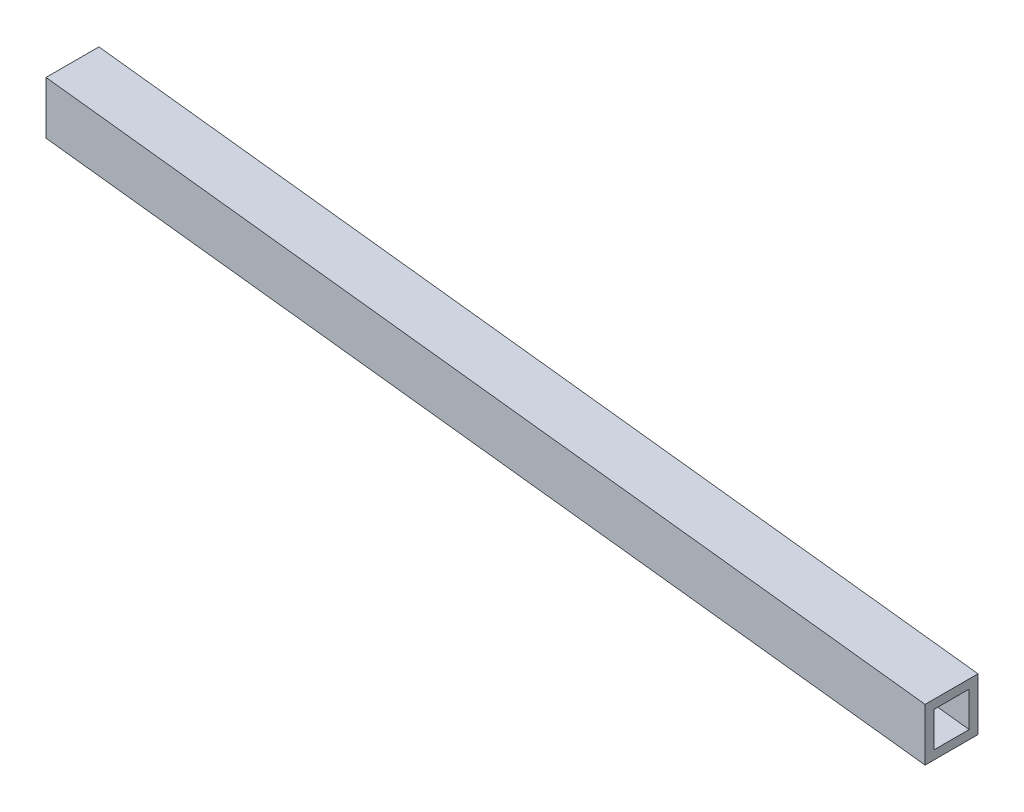
ISO-10303-21;
HEADER;
FILE_DESCRIPTION(('STEP AP214'),'2;1');
FILE_NAME('part.step','',(''),(''),'','','');
FILE_SCHEMA(('AUTOMOTIVE_DESIGN { 1 0 10303 214 1 1 1 1 }'));
ENDSEC;
DATA;
#1=APPLICATION_CONTEXT('core data for automotive mechanical design processes');
#2=APPLICATION_PROTOCOL_DEFINITION('international standard','automotive_design',2000,#1);
#3=PRODUCT_CONTEXT('',#1,'mechanical');
#4=PRODUCT('Part','Part','',(#3));
#5=PRODUCT_RELATED_PRODUCT_CATEGORY('part','',(#4));
#6=PRODUCT_DEFINITION_FORMATION('','',#4);
#7=PRODUCT_DEFINITION_CONTEXT('part definition',#1,'design');
#8=PRODUCT_DEFINITION('design','',#6,#7);
#9=PRODUCT_DEFINITION_SHAPE('','',#8);
#10=(LENGTH_UNIT() NAMED_UNIT(*) SI_UNIT(.MILLI.,.METRE.));
#11=(NAMED_UNIT(*) PLANE_ANGLE_UNIT() SI_UNIT($,.RADIAN.));
#12=(NAMED_UNIT(*) SI_UNIT($,.STERADIAN.) SOLID_ANGLE_UNIT());
#13=UNCERTAINTY_MEASURE_WITH_UNIT(LENGTH_MEASURE(1.E-05),#10,'distance_accuracy_value','');
#14=(GEOMETRIC_REPRESENTATION_CONTEXT(3) GLOBAL_UNCERTAINTY_ASSIGNED_CONTEXT((#13)) GLOBAL_UNIT_ASSIGNED_CONTEXT((#10,
#11,#12)) REPRESENTATION_CONTEXT('',''));
#15=CARTESIAN_POINT('',(0.,0.,0.));
#16=DIRECTION('',(0.,0.,1.));
#17=DIRECTION('',(1.,0.,0.));
#18=AXIS2_PLACEMENT_3D('',#15,#16,#17);
#19=CARTESIAN_POINT('',(711.2,3.175,0.));
#20=DIRECTION('',(0.,1.,0.));
#21=DIRECTION('',(0.,0.,1.));
#22=AXIS2_PLACEMENT_3D('',#19,#20,#21);
#23=PLANE('',#22);
#24=DIRECTION('',(-0.994505452921406,0.,-0.104684784518043));
#25=VECTOR('',#24,1.);
#26=CARTESIAN_POINT('',(711.532374190845,3.175,-3.15755481302547));
#27=LINE('',#26,#25);
#28=CARTESIAN_POINT('',(711.2,3.175,-3.1925415699565));
#29=VERTEX_POINT('',#28);
#30=CARTESIAN_POINT('',(355.6,3.175,-40.624120517325));
#31=VERTEX_POINT('',#30);
#32=EDGE_CURVE('E141',#29,#31,#27,.T.);
#33=ORIENTED_EDGE('',*,*,#32,.F.);
#34=DIRECTION('',(0.,0.,-1.));
#35=VECTOR('',#34,1.);
#36=CARTESIAN_POINT('',(711.2,3.175,0.));
#37=LINE('',#36,#35);
#38=CARTESIAN_POINT('',(711.2,3.175,-15.9627078497824));
#39=VERTEX_POINT('',#38);
#40=EDGE_CURVE('E45',#29,#39,#37,.T.);
#41=ORIENTED_EDGE('',*,*,#40,.T.);
#42=DIRECTION('',(0.994505452921406,0.,0.104684784518043));
#43=VECTOR('',#42,1.);
#44=CARTESIAN_POINT('',(712.861870954224,3.175,-15.7877740651273));
#45=LINE('',#44,#43);
#46=CARTESIAN_POINT('',(355.6,3.175,-53.394286797151));
#47=VERTEX_POINT('',#46);
#48=EDGE_CURVE('E150',#47,#39,#45,.T.);
#49=ORIENTED_EDGE('',*,*,#48,.F.);
#50=DIRECTION('',(0.,0.,1.));
#51=VECTOR('',#50,1.);
#52=CARTESIAN_POINT('',(355.6,3.175,0.));
#53=LINE('',#52,#51);
#54=EDGE_CURVE('E159',#47,#31,#53,.T.);
#55=ORIENTED_EDGE('',*,*,#54,.T.);
#56=EDGE_LOOP('',(#33,#41,#49,#55));
#57=FACE_BOUND('',#56,.T.);
#58=ADVANCED_FACE('F41',(#57),#23,.T.);
#59=CARTESIAN_POINT('',(711.2,3.175,0.));
#60=DIRECTION('',(-0.104684784518043,0.,0.994505452921406));
#61=DIRECTION('',(-0.994505452921406,0.,-0.104684784518043));
#62=AXIS2_PLACEMENT_3D('',#59,#60,#61);
#63=PLANE('',#62);
#64=DIRECTION('',(0.994505452921406,0.,0.104684784518043));
#65=VECTOR('',#64,1.);
#66=CARTESIAN_POINT('',(711.2,0.,0.));
#67=LINE('',#66,#65);
#68=CARTESIAN_POINT('',(355.6,0.,-37.4315789473684));
#69=VERTEX_POINT('',#68);
#70=CARTESIAN_POINT('',(711.2,0.,0.));
#71=VERTEX_POINT('',#70);
#72=EDGE_CURVE('E164',#69,#71,#67,.T.);
#73=ORIENTED_EDGE('',*,*,#72,.T.);
#74=DIRECTION('',(0.,-1.,0.));
#75=VECTOR('',#74,1.);
#76=CARTESIAN_POINT('',(711.2,3.175,0.));
#77=LINE('',#76,#75);
#78=CARTESIAN_POINT('',(711.2,19.05,0.));
#79=VERTEX_POINT('',#78);
#80=EDGE_CURVE('E131',#79,#71,#77,.T.);
#81=ORIENTED_EDGE('',*,*,#80,.F.);
#82=DIRECTION('',(-0.994505452921406,0.,-0.104684784518043));
#83=VECTOR('',#82,1.);
#84=CARTESIAN_POINT('',(711.2,19.05,0.));
#85=LINE('',#84,#83);
#86=CARTESIAN_POINT('',(355.6,19.05,-37.4315789473684));
#87=VERTEX_POINT('',#86);
#88=EDGE_CURVE('E115',#79,#87,#85,.T.);
#89=ORIENTED_EDGE('',*,*,#88,.T.);
#90=DIRECTION('',(0.,-1.,0.));
#91=VECTOR('',#90,1.);
#92=CARTESIAN_POINT('',(355.6,3.175,-37.4315789473684));
#93=LINE('',#92,#91);
#94=EDGE_CURVE('E11',#87,#69,#93,.T.);
#95=ORIENTED_EDGE('',*,*,#94,.T.);
#96=EDGE_LOOP('',(#73,#81,#89,#95));
#97=FACE_BOUND('',#96,.T.);
#98=ADVANCED_FACE('F43',(#97),#63,.T.);
#99=CARTESIAN_POINT('',(355.6,3.175,0.));
#100=DIRECTION('',(-1.,0.,0.));
#101=DIRECTION('',(0.,0.,-1.));
#102=AXIS2_PLACEMENT_3D('',#99,#100,#101);
#103=PLANE('',#102);
#104=DIRECTION('',(0.,-1.,0.));
#105=VECTOR('',#104,1.);
#106=CARTESIAN_POINT('',(355.6,3.175,-56.5868283671075));
#107=LINE('',#106,#105);
#108=CARTESIAN_POINT('',(355.6,19.05,-56.5868283671075));
#109=VERTEX_POINT('',#108);
#110=CARTESIAN_POINT('',(355.6,0.,-56.5868283671075));
#111=VERTEX_POINT('',#110);
#112=EDGE_CURVE('E51',#109,#111,#107,.T.);
#113=ORIENTED_EDGE('',*,*,#112,.T.);
#114=DIRECTION('',(0.,0.,1.));
#115=VECTOR('',#114,1.);
#116=CARTESIAN_POINT('',(355.6,0.,0.));
#117=LINE('',#116,#115);
#118=EDGE_CURVE('E126',#111,#69,#117,.T.);
#119=ORIENTED_EDGE('',*,*,#118,.T.);
#120=ORIENTED_EDGE('',*,*,#94,.F.);
#121=DIRECTION('',(0.,0.,-1.));
#122=VECTOR('',#121,1.);
#123=CARTESIAN_POINT('',(355.6,19.05,-56.5868283671075));
#124=LINE('',#123,#122);
#125=EDGE_CURVE('E111',#87,#109,#124,.T.);
#126=ORIENTED_EDGE('',*,*,#125,.T.);
#127=EDGE_LOOP('',(#113,#119,#120,#126));
#128=FACE_BOUND('',#127,.T.);
#129=DIRECTION('',(0.,0.,-1.));
#130=VECTOR('',#129,1.);
#131=CARTESIAN_POINT('',(355.6,15.875,-56.5868283671075));
#132=LINE('',#131,#130);
#133=CARTESIAN_POINT('',(355.6,15.875,-40.624120517325));
#134=VERTEX_POINT('',#133);
#135=CARTESIAN_POINT('',(355.6,15.875,-53.394286797151));
#136=VERTEX_POINT('',#135);
#137=EDGE_CURVE('E135',#134,#136,#132,.T.);
#138=ORIENTED_EDGE('',*,*,#137,.F.);
#139=DIRECTION('',(0.,-1.,0.));
#140=VECTOR('',#139,1.);
#141=CARTESIAN_POINT('',(355.6,15.875,-40.624120517325));
#142=LINE('',#141,#140);
#143=EDGE_CURVE('E146',#134,#31,#142,.T.);
#144=ORIENTED_EDGE('',*,*,#143,.T.);
#145=ORIENTED_EDGE('',*,*,#54,.F.);
#146=DIRECTION('',(0.,-1.,0.));
#147=VECTOR('',#146,1.);
#148=CARTESIAN_POINT('',(355.6,15.875,-53.394286797151));
#149=LINE('',#148,#147);
#150=EDGE_CURVE('E161',#136,#47,#149,.T.);
#151=ORIENTED_EDGE('',*,*,#150,.F.);
#152=EDGE_LOOP('',(#138,#144,#145,#151));
#153=FACE_BOUND('',#152,.T.);
#154=ADVANCED_FACE('F123',(#128,#153),#103,.T.);
#155=CARTESIAN_POINT('',(713.194245145069,3.175,-18.9453288781528));
#156=DIRECTION('',(0.104684784518043,0.,-0.994505452921406));
#157=DIRECTION('',(0.994505452921406,0.,0.104684784518043));
#158=AXIS2_PLACEMENT_3D('',#155,#156,#157);
#159=PLANE('',#158);
#160=DIRECTION('',(-0.994505452921406,0.,-0.104684784518043));
#161=VECTOR('',#160,1.);
#162=CARTESIAN_POINT('',(713.194245145069,0.,-18.9453288781528));
#163=LINE('',#162,#161);
#164=CARTESIAN_POINT('',(711.2,0.,-19.155249419739));
#165=VERTEX_POINT('',#164);
#166=EDGE_CURVE('E170',#165,#111,#163,.T.);
#167=ORIENTED_EDGE('',*,*,#166,.T.);
#168=ORIENTED_EDGE('',*,*,#112,.F.);
#169=DIRECTION('',(0.994505452921406,0.,0.104684784518043));
#170=VECTOR('',#169,1.);
#171=CARTESIAN_POINT('',(355.6,19.05,-56.5868283671075));
#172=LINE('',#171,#170);
#173=CARTESIAN_POINT('',(711.2,19.05,-19.155249419739));
#174=VERTEX_POINT('',#173);
#175=EDGE_CURVE('E118',#109,#174,#172,.T.);
#176=ORIENTED_EDGE('',*,*,#175,.T.);
#177=DIRECTION('',(0.,-1.,0.));
#178=VECTOR('',#177,1.);
#179=CARTESIAN_POINT('',(711.2,3.175,-19.155249419739));
#180=LINE('',#179,#178);
#181=EDGE_CURVE('E178',#174,#165,#180,.T.);
#182=ORIENTED_EDGE('',*,*,#181,.T.);
#183=EDGE_LOOP('',(#167,#168,#176,#182));
#184=FACE_BOUND('',#183,.T.);
#185=ADVANCED_FACE('F182',(#184),#159,.T.);
#186=CARTESIAN_POINT('',(711.2,3.175,0.));
#187=DIRECTION('',(1.,0.,0.));
#188=DIRECTION('',(0.,0.,1.));
#189=AXIS2_PLACEMENT_3D('',#186,#187,#188);
#190=PLANE('',#189);
#191=DIRECTION('',(0.,-1.,0.));
#192=VECTOR('',#191,1.);
#193=CARTESIAN_POINT('',(711.2,15.875,-15.9627078497824));
#194=LINE('',#193,#192);
#195=CARTESIAN_POINT('',(711.2,15.875,-15.9627078497824));
#196=VERTEX_POINT('',#195);
#197=EDGE_CURVE('E66',#196,#39,#194,.T.);
#198=ORIENTED_EDGE('',*,*,#197,.T.);
#199=ORIENTED_EDGE('',*,*,#40,.F.);
#200=DIRECTION('',(0.,-1.,0.));
#201=VECTOR('',#200,1.);
#202=CARTESIAN_POINT('',(711.2,15.875,-3.1925415699565));
#203=LINE('',#202,#201);
#204=CARTESIAN_POINT('',(711.2,15.875,-3.1925415699565));
#205=VERTEX_POINT('',#204);
#206=EDGE_CURVE('E59',#205,#29,#203,.T.);
#207=ORIENTED_EDGE('',*,*,#206,.F.);
#208=DIRECTION('',(0.,0.,1.));
#209=VECTOR('',#208,1.);
#210=CARTESIAN_POINT('',(711.2,15.875,0.));
#211=LINE('',#210,#209);
#212=EDGE_CURVE('E132',#196,#205,#211,.T.);
#213=ORIENTED_EDGE('',*,*,#212,.F.);
#214=EDGE_LOOP('',(#198,#199,#207,#213));
#215=FACE_BOUND('',#214,.T.);
#216=DIRECTION('',(0.,0.,-1.));
#217=VECTOR('',#216,1.);
#218=CARTESIAN_POINT('',(711.2,0.,0.));
#219=LINE('',#218,#217);
#220=EDGE_CURVE('E175',#71,#165,#219,.T.);
#221=ORIENTED_EDGE('',*,*,#220,.T.);
#222=ORIENTED_EDGE('',*,*,#181,.F.);
#223=DIRECTION('',(0.,0.,1.));
#224=VECTOR('',#223,1.);
#225=CARTESIAN_POINT('',(711.2,19.05,0.));
#226=LINE('',#225,#224);
#227=EDGE_CURVE('E139',#174,#79,#226,.T.);
#228=ORIENTED_EDGE('',*,*,#227,.T.);
#229=ORIENTED_EDGE('',*,*,#80,.T.);
#230=EDGE_LOOP('',(#221,#222,#228,#229));
#231=FACE_BOUND('',#230,.T.);
#232=ADVANCED_FACE('F188',(#215,#231),#190,.T.);
#233=CARTESIAN_POINT('',(711.2,0.,0.));
#234=DIRECTION('',(0.,1.,0.));
#235=DIRECTION('',(0.,0.,1.));
#236=AXIS2_PLACEMENT_3D('',#233,#234,#235);
#237=PLANE('',#236);
#238=ORIENTED_EDGE('',*,*,#72,.F.);
#239=ORIENTED_EDGE('',*,*,#118,.F.);
#240=ORIENTED_EDGE('',*,*,#166,.F.);
#241=ORIENTED_EDGE('',*,*,#220,.F.);
#242=EDGE_LOOP('',(#238,#239,#240,#241));
#243=FACE_BOUND('',#242,.T.);
#244=ADVANCED_FACE('F186',(#243),#237,.F.);
#245=CARTESIAN_POINT('',(712.861870954224,15.875,-15.7877740651273));
#246=DIRECTION('',(-0.104684784518043,0.,0.994505452921406));
#247=DIRECTION('',(-0.994505452921406,0.,-0.104684784518043));
#248=AXIS2_PLACEMENT_3D('',#245,#246,#247);
#249=PLANE('',#248);
#250=ORIENTED_EDGE('',*,*,#48,.T.);
#251=ORIENTED_EDGE('',*,*,#197,.F.);
#252=DIRECTION('',(0.994505452921406,0.,0.104684784518043));
#253=VECTOR('',#252,1.);
#254=CARTESIAN_POINT('',(712.861870954224,15.875,-15.7877740651273));
#255=LINE('',#254,#253);
#256=EDGE_CURVE('E151',#136,#196,#255,.T.);
#257=ORIENTED_EDGE('',*,*,#256,.F.);
#258=ORIENTED_EDGE('',*,*,#150,.T.);
#259=EDGE_LOOP('',(#250,#251,#257,#258));
#260=FACE_BOUND('',#259,.T.);
#261=ADVANCED_FACE('F195',(#260),#249,.T.);
#262=CARTESIAN_POINT('',(711.532374190845,15.875,-3.15755481302547));
#263=DIRECTION('',(0.104684784518043,0.,-0.994505452921406));
#264=DIRECTION('',(0.994505452921406,0.,0.104684784518043));
#265=AXIS2_PLACEMENT_3D('',#262,#263,#264);
#266=PLANE('',#265);
#267=ORIENTED_EDGE('',*,*,#32,.T.);
#268=ORIENTED_EDGE('',*,*,#143,.F.);
#269=DIRECTION('',(-0.994505452921406,0.,-0.104684784518043));
#270=VECTOR('',#269,1.);
#271=CARTESIAN_POINT('',(711.532374190845,15.875,-3.15755481302547));
#272=LINE('',#271,#270);
#273=EDGE_CURVE('E144',#205,#134,#272,.T.);
#274=ORIENTED_EDGE('',*,*,#273,.F.);
#275=ORIENTED_EDGE('',*,*,#206,.T.);
#276=EDGE_LOOP('',(#267,#268,#274,#275));
#277=FACE_BOUND('',#276,.T.);
#278=ADVANCED_FACE('F208',(#277),#266,.T.);
#279=CARTESIAN_POINT('',(711.2,19.05,0.));
#280=DIRECTION('',(0.,-1.,0.));
#281=DIRECTION('',(0.,0.,-1.));
#282=AXIS2_PLACEMENT_3D('',#279,#280,#281);
#283=PLANE('',#282);
#284=ORIENTED_EDGE('',*,*,#88,.F.);
#285=ORIENTED_EDGE('',*,*,#227,.F.);
#286=ORIENTED_EDGE('',*,*,#175,.F.);
#287=ORIENTED_EDGE('',*,*,#125,.F.);
#288=EDGE_LOOP('',(#284,#285,#286,#287));
#289=FACE_BOUND('',#288,.T.);
#290=ADVANCED_FACE('F113',(#289),#283,.F.);
#291=CARTESIAN_POINT('',(711.2,15.875,0.));
#292=DIRECTION('',(0.,-1.,0.));
#293=DIRECTION('',(0.,0.,-1.));
#294=AXIS2_PLACEMENT_3D('',#291,#292,#293);
#295=PLANE('',#294);
#296=ORIENTED_EDGE('',*,*,#212,.T.);
#297=ORIENTED_EDGE('',*,*,#273,.T.);
#298=ORIENTED_EDGE('',*,*,#137,.T.);
#299=ORIENTED_EDGE('',*,*,#256,.T.);
#300=EDGE_LOOP('',(#296,#297,#298,#299));
#301=FACE_BOUND('',#300,.T.);
#302=ADVANCED_FACE('F211',(#301),#295,.T.);
#303=CLOSED_SHELL('',(#58,#98,#154,#185,#232,#244,#261,#278,#290,#302));
#304=MANIFOLD_SOLID_BREP('B2',#303);
#305=ADVANCED_BREP_SHAPE_REPRESENTATION('',(#18,#304),#14);
#306=SHAPE_DEFINITION_REPRESENTATION(#9,#305);
ENDSEC;
END-ISO-10303-21;
